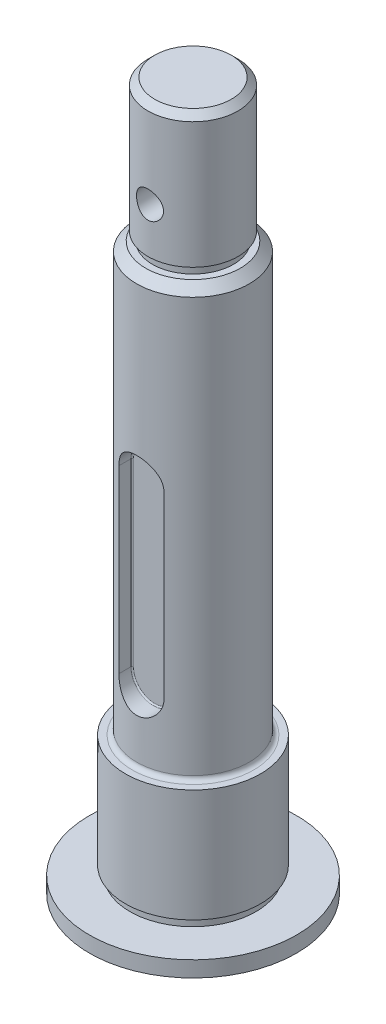
ISO-10303-21;
HEADER;
FILE_DESCRIPTION(('STEP AP214'),'2;1');
FILE_NAME('part.step','',(''),(''),'','','');
FILE_SCHEMA(('AUTOMOTIVE_DESIGN { 1 0 10303 214 1 1 1 1 }'));
ENDSEC;
DATA;
#1=APPLICATION_CONTEXT('core data for automotive mechanical design processes');
#2=APPLICATION_PROTOCOL_DEFINITION('international standard','automotive_design',2000,#1);
#3=PRODUCT_CONTEXT('',#1,'mechanical');
#4=PRODUCT('Part','Part','',(#3));
#5=PRODUCT_RELATED_PRODUCT_CATEGORY('part','',(#4));
#6=PRODUCT_DEFINITION_FORMATION('','',#4);
#7=PRODUCT_DEFINITION_CONTEXT('part definition',#1,'design');
#8=PRODUCT_DEFINITION('design','',#6,#7);
#9=PRODUCT_DEFINITION_SHAPE('','',#8);
#10=(LENGTH_UNIT() NAMED_UNIT(*) SI_UNIT(.MILLI.,.METRE.));
#11=(NAMED_UNIT(*) PLANE_ANGLE_UNIT() SI_UNIT($,.RADIAN.));
#12=(NAMED_UNIT(*) SI_UNIT($,.STERADIAN.) SOLID_ANGLE_UNIT());
#13=UNCERTAINTY_MEASURE_WITH_UNIT(LENGTH_MEASURE(1.E-05),#10,'distance_accuracy_value','');
#14=(GEOMETRIC_REPRESENTATION_CONTEXT(3) GLOBAL_UNCERTAINTY_ASSIGNED_CONTEXT((#13)) GLOBAL_UNIT_ASSIGNED_CONTEXT((#10,
#11,#12)) REPRESENTATION_CONTEXT('',''));
#15=CARTESIAN_POINT('',(0.,0.,0.));
#16=DIRECTION('',(0.,0.,1.));
#17=DIRECTION('',(1.,0.,0.));
#18=AXIS2_PLACEMENT_3D('',#15,#16,#17);
#19=CARTESIAN_POINT('',(0.,0.,0.));
#20=DIRECTION('',(0.,1.,0.));
#21=DIRECTION('',(-1.,0.,0.));
#22=AXIS2_PLACEMENT_3D('',#19,#20,#21);
#23=PLANE('',#22);
#24=CARTESIAN_POINT('',(0.,0.,0.));
#25=DIRECTION('',(0.,1.,0.));
#26=DIRECTION('',(-1.,0.,0.));
#27=AXIS2_PLACEMENT_3D('',#24,#25,#26);
#28=CIRCLE('',#27,23.);
#29=CARTESIAN_POINT('',(-23.,0.,0.));
#30=VERTEX_POINT('',#29);
#31=EDGE_CURVE('E115',#30,#30,#28,.T.);
#32=ORIENTED_EDGE('',*,*,#31,.F.);
#33=EDGE_LOOP('',(#32));
#34=FACE_BOUND('',#33,.T.);
#35=ADVANCED_FACE('F35',(#34),#23,.F.);
#36=CARTESIAN_POINT('',(0.,157.,0.));
#37=DIRECTION('',(0.,1.,0.));
#38=DIRECTION('',(-1.,0.,0.));
#39=AXIS2_PLACEMENT_3D('',#36,#37,#38);
#40=CYLINDRICAL_SURFACE('',#39,23.);
#41=CARTESIAN_POINT('',(0.,3.5,0.));
#42=DIRECTION('',(0.,1.,0.));
#43=DIRECTION('',(-1.,0.,0.));
#44=AXIS2_PLACEMENT_3D('',#41,#42,#43);
#45=CIRCLE('',#44,23.);
#46=CARTESIAN_POINT('',(-23.,3.5,0.));
#47=VERTEX_POINT('',#46);
#48=EDGE_CURVE('E119',#47,#47,#45,.T.);
#49=ORIENTED_EDGE('',*,*,#48,.F.);
#50=EDGE_LOOP('',(#49));
#51=FACE_BOUND('',#50,.T.);
#52=ORIENTED_EDGE('',*,*,#31,.T.);
#53=EDGE_LOOP('',(#52));
#54=FACE_BOUND('',#53,.T.);
#55=ADVANCED_FACE('F181',(#51,#54),#40,.T.);
#56=CARTESIAN_POINT('',(23.,3.5,0.));
#57=DIRECTION('',(0.,-1.,0.));
#58=DIRECTION('',(1.,0.,0.));
#59=AXIS2_PLACEMENT_3D('',#56,#57,#58);
#60=PLANE('',#59);
#61=CARTESIAN_POINT('',(0.,3.5,0.));
#62=DIRECTION('',(0.,1.,0.));
#63=DIRECTION('',(-1.,0.,0.));
#64=AXIS2_PLACEMENT_3D('',#61,#62,#63);
#65=CIRCLE('',#64,14.);
#66=CARTESIAN_POINT('',(-14.,3.5,0.));
#67=VERTEX_POINT('',#66);
#68=EDGE_CURVE('E277',#67,#67,#65,.T.);
#69=ORIENTED_EDGE('',*,*,#68,.F.);
#70=EDGE_LOOP('',(#69));
#71=FACE_BOUND('',#70,.T.);
#72=ORIENTED_EDGE('',*,*,#48,.T.);
#73=EDGE_LOOP('',(#72));
#74=FACE_BOUND('',#73,.T.);
#75=ADVANCED_FACE('F187',(#71,#74),#60,.F.);
#76=CARTESIAN_POINT('',(0.,157.,0.));
#77=DIRECTION('',(0.,1.,0.));
#78=DIRECTION('',(-1.,0.,0.));
#79=AXIS2_PLACEMENT_3D('',#76,#77,#78);
#80=CYLINDRICAL_SURFACE('',#79,14.);
#81=CARTESIAN_POINT('',(0.,5.50000000000001,0.));
#82=DIRECTION('',(0.,1.,0.));
#83=DIRECTION('',(-1.,0.,0.));
#84=AXIS2_PLACEMENT_3D('',#81,#82,#83);
#85=CIRCLE('',#84,14.);
#86=CARTESIAN_POINT('',(-14.,5.50000000000001,0.));
#87=VERTEX_POINT('',#86);
#88=EDGE_CURVE('E274',#87,#87,#85,.T.);
#89=ORIENTED_EDGE('',*,*,#88,.F.);
#90=EDGE_LOOP('',(#89));
#91=FACE_BOUND('',#90,.T.);
#92=ORIENTED_EDGE('',*,*,#68,.T.);
#93=EDGE_LOOP('',(#92));
#94=FACE_BOUND('',#93,.T.);
#95=ADVANCED_FACE('F284',(#91,#94),#80,.T.);
#96=CARTESIAN_POINT('',(14.,5.5,0.));
#97=DIRECTION('',(0.,1.,0.));
#98=DIRECTION('',(-1.,0.,0.));
#99=AXIS2_PLACEMENT_3D('',#96,#97,#98);
#100=PLANE('',#99);
#101=CARTESIAN_POINT('',(0.,5.50000000000001,0.));
#102=DIRECTION('',(0.,1.,0.));
#103=DIRECTION('',(-1.,0.,0.));
#104=AXIS2_PLACEMENT_3D('',#101,#102,#103);
#105=CIRCLE('',#104,15.);
#106=CARTESIAN_POINT('',(-15.,5.50000000000001,0.));
#107=VERTEX_POINT('',#106);
#108=EDGE_CURVE('E271',#107,#107,#105,.T.);
#109=ORIENTED_EDGE('',*,*,#108,.F.);
#110=EDGE_LOOP('',(#109));
#111=FACE_BOUND('',#110,.T.);
#112=ORIENTED_EDGE('',*,*,#88,.T.);
#113=EDGE_LOOP('',(#112));
#114=FACE_BOUND('',#113,.T.);
#115=ADVANCED_FACE('F289',(#111,#114),#100,.F.);
#116=CARTESIAN_POINT('',(0.,157.,0.));
#117=DIRECTION('',(0.,1.,0.));
#118=DIRECTION('',(-1.,0.,0.));
#119=AXIS2_PLACEMENT_3D('',#116,#117,#118);
#120=CYLINDRICAL_SURFACE('',#119,15.);
#121=CARTESIAN_POINT('',(0.,30.5,0.));
#122=DIRECTION('',(0.,1.,0.));
#123=DIRECTION('',(-1.,0.,0.));
#124=AXIS2_PLACEMENT_3D('',#121,#122,#123);
#125=CIRCLE('',#124,15.);
#126=CARTESIAN_POINT('',(-15.,30.5,0.));
#127=VERTEX_POINT('',#126);
#128=EDGE_CURVE('E268',#127,#127,#125,.T.);
#129=ORIENTED_EDGE('',*,*,#128,.F.);
#130=EDGE_LOOP('',(#129));
#131=FACE_BOUND('',#130,.T.);
#132=ORIENTED_EDGE('',*,*,#108,.T.);
#133=EDGE_LOOP('',(#132));
#134=FACE_BOUND('',#133,.T.);
#135=ADVANCED_FACE('F296',(#131,#134),#120,.T.);
#136=CARTESIAN_POINT('',(15.,30.5,0.));
#137=DIRECTION('',(0.,-1.,0.));
#138=DIRECTION('',(1.,0.,0.));
#139=AXIS2_PLACEMENT_3D('',#136,#137,#138);
#140=PLANE('',#139);
#141=CARTESIAN_POINT('',(0.,30.5,0.));
#142=DIRECTION('',(0.,1.,0.));
#143=DIRECTION('',(-1.,0.,0.));
#144=AXIS2_PLACEMENT_3D('',#141,#142,#143);
#145=CIRCLE('',#144,13.5);
#146=CARTESIAN_POINT('',(-13.5,30.5,0.));
#147=VERTEX_POINT('',#146);
#148=EDGE_CURVE('E265',#147,#147,#145,.T.);
#149=ORIENTED_EDGE('',*,*,#148,.F.);
#150=EDGE_LOOP('',(#149));
#151=FACE_BOUND('',#150,.T.);
#152=ORIENTED_EDGE('',*,*,#128,.T.);
#153=EDGE_LOOP('',(#152));
#154=FACE_BOUND('',#153,.T.);
#155=ADVANCED_FACE('F300',(#151,#154),#140,.F.);
#156=CARTESIAN_POINT('',(0.,31.5,0.));
#157=DIRECTION('',(0.,1.,0.));
#158=DIRECTION('',(-1.,0.,0.));
#159=AXIS2_PLACEMENT_3D('',#156,#157,#158);
#160=TOROIDAL_SURFACE('',#159,13.5,0.999999999999999);
#161=CARTESIAN_POINT('',(0.,31.5,0.));
#162=DIRECTION('',(0.,1.,0.));
#163=DIRECTION('',(-1.,0.,0.));
#164=AXIS2_PLACEMENT_3D('',#161,#162,#163);
#165=CIRCLE('',#164,12.5);
#166=CARTESIAN_POINT('',(-12.5,31.5,0.));
#167=VERTEX_POINT('',#166);
#168=EDGE_CURVE('E262',#167,#167,#165,.T.);
#169=ORIENTED_EDGE('',*,*,#168,.F.);
#170=EDGE_LOOP('',(#169));
#171=FACE_BOUND('',#170,.T.);
#172=ORIENTED_EDGE('',*,*,#148,.T.);
#173=EDGE_LOOP('',(#172));
#174=FACE_BOUND('',#173,.T.);
#175=ADVANCED_FACE('F303',(#171,#174),#160,.F.);
#176=CARTESIAN_POINT('',(0.,157.,0.));
#177=DIRECTION('',(0.,1.,0.));
#178=DIRECTION('',(-1.,0.,0.));
#179=AXIS2_PLACEMENT_3D('',#176,#177,#178);
#180=CYLINDRICAL_SURFACE('',#179,12.5);
#181=DIRECTION('',(0.,1.,0.));
#182=VECTOR('',#181,1.);
#183=CARTESIAN_POINT('',(-5.00000000000001,157.,11.4564392373896));
#184=LINE('',#183,#182);
#185=CARTESIAN_POINT('',(-4.99999999999999,45.5,11.4564392373896));
#186=VERTEX_POINT('',#185);
#187=CARTESIAN_POINT('',(-5.00000000000001,85.4999999999999,11.4564392373896));
#188=VERTEX_POINT('',#187);
#189=EDGE_CURVE('E109',#186,#188,#184,.T.);
#190=ORIENTED_EDGE('',*,*,#189,.T.);
#191=CARTESIAN_POINT('',(-5.00000000000001,85.4999999999999,11.4564392373896));
#192=CARTESIAN_POINT('',(-5.00002116024616,85.6345124320606,11.4564109509945));
#193=CARTESIAN_POINT('',(-4.99457288869913,85.7690130645395,11.4588073206432));
#194=CARTESIAN_POINT('',(-4.97289704500259,86.0369293446743,11.4682409636927));
#195=CARTESIAN_POINT('',(-4.95667357829301,86.1703453859789,11.4752764695362));
#196=CARTESIAN_POINT('',(-4.91369129558914,86.4346148649349,11.4937439172796));
#197=CARTESIAN_POINT('',(-4.88697412617558,86.5654763118979,11.5051584758264));
#198=CARTESIAN_POINT('',(-4.82328654884511,86.8242595779647,11.5320036246689));
#199=CARTESIAN_POINT('',(-4.78631551505478,86.9521812171127,11.5474344601058));
#200=CARTESIAN_POINT('',(-4.70252103978111,87.2040793676233,11.5818106822086));
#201=CARTESIAN_POINT('',(-4.65571075709794,87.3280608959935,11.6007513709062));
#202=CARTESIAN_POINT('',(-4.55261160789531,87.5715287286217,11.6415978912418));
#203=CARTESIAN_POINT('',(-4.4963191779988,87.6910133222088,11.6635048369856));
#204=CARTESIAN_POINT('',(-4.31376922877803,88.0418102403852,11.7327894866887));
#205=CARTESIAN_POINT('',(-4.17383337305161,88.2654826382452,11.7837334464308));
#206=CARTESIAN_POINT('',(-3.85328699437734,88.6982019808576,11.8925290853841));
#207=CARTESIAN_POINT('',(-3.67095756312249,88.9059091956254,11.9506010980043));
#208=CARTESIAN_POINT('',(-3.27420643347806,89.2888595291701,12.0653248053599));
#209=CARTESIAN_POINT('',(-3.05977816286379,89.4640959830899,12.1219762064459));
#210=CARTESIAN_POINT('',(-2.71343385084917,89.7021452098314,12.2025476404464));
#211=CARTESIAN_POINT('',(-2.59127203287559,89.7785668493419,12.229134001304));
#212=CARTESIAN_POINT('',(-2.34039970046137,89.9207787547715,12.2796116610867));
#213=CARTESIAN_POINT('',(-2.21169191329334,89.9865734013116,12.3035040692708));
#214=CARTESIAN_POINT('',(-1.94856415474309,90.1069555865197,12.3479110926869));
#215=CARTESIAN_POINT('',(-1.81414357108403,90.1615419202468,12.3684253447059));
#216=CARTESIAN_POINT('',(-1.5406320394055,90.2589400533107,12.4054617264858));
#217=CARTESIAN_POINT('',(-1.40154340020451,90.301757579931,12.4219857975888));
#218=CARTESIAN_POINT('',(-1.12649875188942,90.3734195005113,12.4498667432373));
#219=CARTESIAN_POINT('',(-0.990712972335601,90.4028360840672,12.4614336192513));
#220=CARTESIAN_POINT('',(-0.716923447431974,90.4502841254754,12.480177753411));
#221=CARTESIAN_POINT('',(-0.578920699676974,90.4683205647395,12.4873569321329));
#222=CARTESIAN_POINT('',(-0.3017429280837,90.4928255327452,12.4971268844119));
#223=CARTESIAN_POINT('',(-0.162568016896016,90.4992951606507,12.4997180939517));
#224=CARTESIAN_POINT('',(0.115842484012882,90.5005956749877,12.500238240505));
#225=CARTESIAN_POINT('',(0.25507807142947,90.4954269704835,12.4981673413824));
#226=CARTESIAN_POINT('',(0.524651970400589,90.4741308146542,12.4896713366005));
#227=CARTESIAN_POINT('',(0.655048966944768,90.4586382483151,12.4834985427991));
#228=CARTESIAN_POINT('',(0.914022837957907,90.4174952903848,12.4672131439381));
#229=CARTESIAN_POINT('',(1.0425990928298,90.3918415230812,12.4570992295938));
#230=CARTESIAN_POINT('',(1.29697755626972,90.3306263277609,12.4331876533791));
#231=CARTESIAN_POINT('',(1.42278070740589,90.2950683239934,12.4193912647406));
#232=CARTESIAN_POINT('',(1.67086757221275,90.2143659568798,12.3884570972524));
#233=CARTESIAN_POINT('',(1.79314992921957,90.1692179529119,12.3713180496423));
#234=CARTESIAN_POINT('',(2.15709687028237,90.0184541657438,12.3149325863107));
#235=CARTESIAN_POINT('',(2.39225143382088,89.8983913777321,12.2710729537441));
#236=CARTESIAN_POINT('',(2.83955938188382,89.6238240436676,12.175361464094));
#237=CARTESIAN_POINT('',(3.05170465810883,89.4693074145782,12.1235068051106));
#238=CARTESIAN_POINT('',(3.46189166322706,89.1184034138569,12.0130472510456));
#239=CARTESIAN_POINT('',(3.65809600081913,88.9199346428211,11.9542226888218));
#240=CARTESIAN_POINT('',(4.01527141902245,88.4925089145393,11.8390417472991));
#241=CARTESIAN_POINT('',(4.17622644798531,88.2635381434619,11.7826865017702));
#242=CARTESIAN_POINT('',(4.38982639253539,87.8979555339677,11.7040767056709));
#243=CARTESIAN_POINT('',(4.45714070918035,87.7704102321506,11.67853963431));
#244=CARTESIAN_POINT('',(4.58068459393733,87.5095096052855,11.6306369662179));
#245=CARTESIAN_POINT('',(4.63691894003212,87.3761568150088,11.6082700036232));
#246=CARTESIAN_POINT('',(4.73770315812052,87.1047138431704,11.5675031334143));
#247=CARTESIAN_POINT('',(4.7822675419941,86.9666297891435,11.5490983039107));
#248=CARTESIAN_POINT('',(4.85931060760166,86.6866645381195,11.5168933461878));
#249=CARTESIAN_POINT('',(4.89179470795395,86.5447850742428,11.5030911537407));
#250=CARTESIAN_POINT('',(4.94524241843461,86.253193191337,11.4802224777034));
#251=CARTESIAN_POINT('',(4.96575156895815,86.1033822570495,11.4713433844497));
#252=CARTESIAN_POINT('',(4.99314310596509,85.8023863383243,11.4594310700134));
#253=CARTESIAN_POINT('',(5.0000338891365,85.6512022583381,11.4563942466884));
#254=CARTESIAN_POINT('',(5.,85.4999999999999,11.4564392373896));
#255=B_SPLINE_CURVE_WITH_KNOTS('',3,(#191,#192,#193,#194,#195,#196,#197,#198,#199,#200,#201,
#202,#203,#204,#205,#206,#207,#208,#209,#210,#211,#212,#213,#214,#215,#216,#217,#218,#219,#220,
#221,#222,#223,#224,#225,#226,#227,#228,#229,#230,#231,#232,#233,#234,#235,#236,#237,#238,#239,
#240,#241,#242,#243,#244,#245,#246,#247,#248,#249,#250,#251,#252,#253,#254),.UNSPECIFIED.,.F.,
.F.,(4,2,2,2,2,2,2,2,2,2,2,2,2,2,2,2,2,2,2,2,2,2,2,2,2,2,2,2,2,2,2,4),(0.,0.403387132772953,
0.806620659758034,1.20826977817943,1.60994341778078,2.01108324721979,2.4123741621189,
3.21490253133681,4.05861785764907,4.90250617122559,5.34163056425766,5.780573478467,
6.21956355621626,6.65833961990581,7.07604861266469,7.49357463528174,7.91106097937957,
8.32853264988812,8.72244552722558,9.11648937858482,9.51039716361132,9.90445475472554,
10.7036301452728,11.5030862504097,12.3549725889497,13.2072460521693,13.6461605184396,
14.0848852966823,14.5230618911476,14.9610417034976,15.4147136276398,15.8681057435335),.UNSPECIFIED.);
#256=CARTESIAN_POINT('',(5.,85.4999999999999,11.4564392373896));
#257=VERTEX_POINT('',#256);
#258=EDGE_CURVE('E95',#188,#257,#255,.T.);
#259=ORIENTED_EDGE('',*,*,#258,.T.);
#260=DIRECTION('',(0.,1.,0.));
#261=VECTOR('',#260,1.);
#262=CARTESIAN_POINT('',(5.00000000000001,157.,11.4564392373896));
#263=LINE('',#262,#261);
#264=CARTESIAN_POINT('',(5.00000000000001,45.5,11.4564392373896));
#265=VERTEX_POINT('',#264);
#266=EDGE_CURVE('E103',#257,#265,#263,.F.);
#267=ORIENTED_EDGE('',*,*,#266,.T.);
#268=CARTESIAN_POINT('',(4.99999999999999,45.5,11.4564392373896));
#269=CARTESIAN_POINT('',(5.00002116024614,45.3654875679393,11.4564109509945));
#270=CARTESIAN_POINT('',(4.99457288869911,45.2309869354604,11.4588073206432));
#271=CARTESIAN_POINT('',(4.97289704500257,44.9630706553256,11.4682409636927));
#272=CARTESIAN_POINT('',(4.95667357829299,44.8296546140211,11.4752764695362));
#273=CARTESIAN_POINT('',(4.91369129558912,44.565385135065,11.4937439172796));
#274=CARTESIAN_POINT('',(4.88697412617556,44.434523688102,11.5051584758264));
#275=CARTESIAN_POINT('',(4.8232865488451,44.1757404220352,11.5320036246689));
#276=CARTESIAN_POINT('',(4.78631551505476,44.0478187828872,11.5474344601058));
#277=CARTESIAN_POINT('',(4.70252103978109,43.7959206323767,11.5818106822086));
#278=CARTESIAN_POINT('',(4.65571075709792,43.6719391040064,11.6007513709062));
#279=CARTESIAN_POINT('',(4.5526116078953,43.4284712713783,11.6415978912418));
#280=CARTESIAN_POINT('',(4.49631917799878,43.3089866777911,11.6635048369856));
#281=CARTESIAN_POINT('',(4.31376922877801,42.9581897596147,11.7327894866887));
#282=CARTESIAN_POINT('',(4.1738333730516,42.7345173617548,11.7837334464308));
#283=CARTESIAN_POINT('',(3.85328699437733,42.3017980191423,11.8925290853841));
#284=CARTESIAN_POINT('',(3.67095756312248,42.0940908043745,11.9506010980043));
#285=CARTESIAN_POINT('',(3.27420643347805,41.7111404708298,12.0653248053599));
#286=CARTESIAN_POINT('',(3.05977816286378,41.53590401691,12.1219762064459));
#287=CARTESIAN_POINT('',(2.71343385084916,41.2978547901685,12.2025476404464));
#288=CARTESIAN_POINT('',(2.59127203287557,41.2214331506581,12.229134001304));
#289=CARTESIAN_POINT('',(2.34039970046135,41.0792212452285,12.2796116610867));
#290=CARTESIAN_POINT('',(2.21169191329332,41.0134265986884,12.3035040692708));
#291=CARTESIAN_POINT('',(1.94856415474307,40.8930444134802,12.3479110926869));
#292=CARTESIAN_POINT('',(1.81414357108401,40.8384580797531,12.3684253447059));
#293=CARTESIAN_POINT('',(1.54063203940548,40.7410599466892,12.4054617264858));
#294=CARTESIAN_POINT('',(1.40154340020449,40.6982424200689,12.4219857975888));
#295=CARTESIAN_POINT('',(1.1264987518894,40.6265804994886,12.4498667432373));
#296=CARTESIAN_POINT('',(0.990712972335582,40.5971639159328,12.4614336192513));
#297=CARTESIAN_POINT('',(0.716923447431953,40.5497158745245,12.480177753411));
#298=CARTESIAN_POINT('',(0.578920699676954,40.5316794352604,12.4873569321329));
#299=CARTESIAN_POINT('',(0.301742928083682,40.5071744672548,12.4971268844119));
#300=CARTESIAN_POINT('',(0.162568016895998,40.5007048393492,12.4997180939517));
#301=CARTESIAN_POINT('',(-0.115842484012899,40.4994043250122,12.500238240505));
#302=CARTESIAN_POINT('',(-0.255078071429487,40.5045730295164,12.4981673413824));
#303=CARTESIAN_POINT('',(-0.524651970400604,40.5258691853457,12.4896713366005));
#304=CARTESIAN_POINT('',(-0.655048966944781,40.5413617516848,12.4834985427991));
#305=CARTESIAN_POINT('',(-0.914022837957918,40.5825047096151,12.4672131439381));
#306=CARTESIAN_POINT('',(-1.04259909282981,40.6081584769187,12.4570992295938));
#307=CARTESIAN_POINT('',(-1.29697755626973,40.6693736722391,12.4331876533791));
#308=CARTESIAN_POINT('',(-1.4227807074059,40.7049316760065,12.4193912647406));
#309=CARTESIAN_POINT('',(-1.67086757221276,40.7856340431202,12.3884570972524));
#310=CARTESIAN_POINT('',(-1.79314992921958,40.830782047088,12.3713180496423));
#311=CARTESIAN_POINT('',(-2.15709687028238,40.9815458342561,12.3149325863107));
#312=CARTESIAN_POINT('',(-2.39225143382089,41.1016086222678,12.2710729537441));
#313=CARTESIAN_POINT('',(-2.83955938188382,41.3761759563323,12.175361464094));
#314=CARTESIAN_POINT('',(-3.05170465810884,41.5306925854218,12.1235068051106));
#315=CARTESIAN_POINT('',(-3.46189166322707,41.881596586143,12.0130472510456));
#316=CARTESIAN_POINT('',(-3.65809600081914,42.0800653571789,11.9542226888218));
#317=CARTESIAN_POINT('',(-4.01527141902246,42.5074910854606,11.8390417472991));
#318=CARTESIAN_POINT('',(-4.17622644798532,42.736461856538,11.7826865017702));
#319=CARTESIAN_POINT('',(-4.3898263925354,43.1020444660322,11.7040767056709));
#320=CARTESIAN_POINT('',(-4.45714070918036,43.2295897678493,11.67853963431));
#321=CARTESIAN_POINT('',(-4.58068459393734,43.4904903947145,11.6306369662179));
#322=CARTESIAN_POINT('',(-4.63691894003213,43.6238431849912,11.6082700036232));
#323=CARTESIAN_POINT('',(-4.73770315812053,43.8952861568295,11.5675031334143));
#324=CARTESIAN_POINT('',(-4.78226754199411,44.0333702108564,11.5490983039107));
#325=CARTESIAN_POINT('',(-4.85931060760167,44.3133354618804,11.5168933461878));
#326=CARTESIAN_POINT('',(-4.89179470795396,44.4552149257571,11.5030911537407));
#327=CARTESIAN_POINT('',(-4.94524241843462,44.7468068086629,11.4802224777034));
#328=CARTESIAN_POINT('',(-4.96575156895816,44.8966177429504,11.4713433844497));
#329=CARTESIAN_POINT('',(-4.9931431059651,45.1976136616756,11.4594310700134));
#330=CARTESIAN_POINT('',(-5.00003388913651,45.3487977416618,11.4563942466884));
#331=CARTESIAN_POINT('',(-5.,45.5,11.4564392373896));
#332=B_SPLINE_CURVE_WITH_KNOTS('',3,(#268,#269,#270,#271,#272,#273,#274,#275,#276,#277,#278,
#279,#280,#281,#282,#283,#284,#285,#286,#287,#288,#289,#290,#291,#292,#293,#294,#295,#296,#297,
#298,#299,#300,#301,#302,#303,#304,#305,#306,#307,#308,#309,#310,#311,#312,#313,#314,#315,#316,
#317,#318,#319,#320,#321,#322,#323,#324,#325,#326,#327,#328,#329,#330,#331),.UNSPECIFIED.,.F.,
.F.,(4,2,2,2,2,2,2,2,2,2,2,2,2,2,2,2,2,2,2,2,2,2,2,2,2,2,2,2,2,2,2,4),(0.,0.403387132772953,
0.806620659758027,1.20826977817944,1.60994341778077,2.01108324721977,2.41237416211889,
3.2149025313368,4.05861785764906,4.90250617122559,5.34163056425765,5.78057347846699,
6.21956355621626,6.6583396199058,7.07604861266469,7.49357463528174,7.91106097937956,
8.32853264988811,8.72244552722557,9.11648937858481,9.5103971636113,9.90445475472552,
10.7036301452728,11.5030862504096,12.3549725889497,13.2072460521693,13.6461605184395,
14.0848852966823,14.5230618911475,14.9610417034976,15.4147136276398,15.8681057435335),.UNSPECIFIED.);
#333=EDGE_CURVE('E110',#265,#186,#332,.T.);
#334=ORIENTED_EDGE('',*,*,#333,.T.);
#335=EDGE_LOOP('',(#190,#259,#267,#334));
#336=FACE_BOUND('',#335,.T.);
#337=CARTESIAN_POINT('',(0.,123.5,0.));
#338=DIRECTION('',(0.,1.,0.));
#339=DIRECTION('',(-1.,0.,0.));
#340=AXIS2_PLACEMENT_3D('',#337,#338,#339);
#341=CIRCLE('',#340,12.5);
#342=CARTESIAN_POINT('',(-12.5,123.5,0.));
#343=VERTEX_POINT('',#342);
#344=EDGE_CURVE('E259',#343,#343,#341,.T.);
#345=ORIENTED_EDGE('',*,*,#344,.F.);
#346=EDGE_LOOP('',(#345));
#347=FACE_BOUND('',#346,.T.);
#348=ORIENTED_EDGE('',*,*,#168,.T.);
#349=EDGE_LOOP('',(#348));
#350=FACE_BOUND('',#349,.T.);
#351=ADVANCED_FACE('F112',(#336,#347,#350),#180,.T.);
#352=CARTESIAN_POINT('',(0.,123.5,0.));
#353=DIRECTION('',(0.,-1.,0.));
#354=DIRECTION('',(1.,0.,0.));
#355=AXIS2_PLACEMENT_3D('',#352,#353,#354);
#356=CONICAL_SURFACE('',#355,12.5,0.785398163397453);
#357=CARTESIAN_POINT('',(0.,125.5,0.));
#358=DIRECTION('',(0.,1.,0.));
#359=DIRECTION('',(-1.,0.,0.));
#360=AXIS2_PLACEMENT_3D('',#357,#358,#359);
#361=CIRCLE('',#360,10.5);
#362=CARTESIAN_POINT('',(-10.5,125.5,0.));
#363=VERTEX_POINT('',#362);
#364=EDGE_CURVE('E256',#363,#363,#361,.T.);
#365=ORIENTED_EDGE('',*,*,#364,.F.);
#366=EDGE_LOOP('',(#365));
#367=FACE_BOUND('',#366,.T.);
#368=ORIENTED_EDGE('',*,*,#344,.T.);
#369=EDGE_LOOP('',(#368));
#370=FACE_BOUND('',#369,.T.);
#371=ADVANCED_FACE('F310',(#367,#370),#356,.T.);
#372=CARTESIAN_POINT('',(10.5,125.5,0.));
#373=DIRECTION('',(0.,-1.,0.));
#374=DIRECTION('',(1.,0.,0.));
#375=AXIS2_PLACEMENT_3D('',#372,#373,#374);
#376=PLANE('',#375);
#377=CARTESIAN_POINT('',(0.,125.5,0.));
#378=DIRECTION('',(0.,1.,0.));
#379=DIRECTION('',(-1.,0.,0.));
#380=AXIS2_PLACEMENT_3D('',#377,#378,#379);
#381=CIRCLE('',#380,9.);
#382=CARTESIAN_POINT('',(-9.,125.5,0.));
#383=VERTEX_POINT('',#382);
#384=EDGE_CURVE('E253',#383,#383,#381,.T.);
#385=ORIENTED_EDGE('',*,*,#384,.F.);
#386=EDGE_LOOP('',(#385));
#387=FACE_BOUND('',#386,.T.);
#388=ORIENTED_EDGE('',*,*,#364,.T.);
#389=EDGE_LOOP('',(#388));
#390=FACE_BOUND('',#389,.T.);
#391=ADVANCED_FACE('F325',(#387,#390),#376,.F.);
#392=CARTESIAN_POINT('',(0.,157.,0.));
#393=DIRECTION('',(0.,1.,0.));
#394=DIRECTION('',(-1.,0.,0.));
#395=AXIS2_PLACEMENT_3D('',#392,#393,#394);
#396=CYLINDRICAL_SURFACE('',#395,9.);
#397=CARTESIAN_POINT('',(0.,127.5,0.));
#398=DIRECTION('',(0.,1.,0.));
#399=DIRECTION('',(-1.,0.,0.));
#400=AXIS2_PLACEMENT_3D('',#397,#398,#399);
#401=CIRCLE('',#400,9.);
#402=CARTESIAN_POINT('',(-9.,127.5,0.));
#403=VERTEX_POINT('',#402);
#404=EDGE_CURVE('E250',#403,#403,#401,.T.);
#405=ORIENTED_EDGE('',*,*,#404,.F.);
#406=EDGE_LOOP('',(#405));
#407=FACE_BOUND('',#406,.T.);
#408=ORIENTED_EDGE('',*,*,#384,.T.);
#409=EDGE_LOOP('',(#408));
#410=FACE_BOUND('',#409,.T.);
#411=ADVANCED_FACE('F330',(#407,#410),#396,.T.);
#412=CARTESIAN_POINT('',(10.,127.5,0.));
#413=DIRECTION('',(0.,1.,0.));
#414=DIRECTION('',(-1.,0.,0.));
#415=AXIS2_PLACEMENT_3D('',#412,#413,#414);
#416=PLANE('',#415);
#417=CARTESIAN_POINT('',(0.,127.5,0.));
#418=DIRECTION('',(0.,1.,0.));
#419=DIRECTION('',(-1.,0.,0.));
#420=AXIS2_PLACEMENT_3D('',#417,#418,#419);
#421=CIRCLE('',#420,10.);
#422=CARTESIAN_POINT('',(-10.,127.5,0.));
#423=VERTEX_POINT('',#422);
#424=EDGE_CURVE('E247',#423,#423,#421,.T.);
#425=ORIENTED_EDGE('',*,*,#424,.F.);
#426=EDGE_LOOP('',(#425));
#427=FACE_BOUND('',#426,.T.);
#428=ORIENTED_EDGE('',*,*,#404,.T.);
#429=EDGE_LOOP('',(#428));
#430=FACE_BOUND('',#429,.T.);
#431=ADVANCED_FACE('F158',(#427,#430),#416,.F.);
#432=CARTESIAN_POINT('',(0.,157.,0.));
#433=DIRECTION('',(0.,1.,0.));
#434=DIRECTION('',(-1.,0.,0.));
#435=AXIS2_PLACEMENT_3D('',#432,#433,#434);
#436=CYLINDRICAL_SURFACE('',#435,10.);
#437=CARTESIAN_POINT('',(3.,137.5,-9.53939201416946));
#438=CARTESIAN_POINT('',(2.99999795267528,137.664389095885,-9.5393937145396));
#439=CARTESIAN_POINT('',(2.98644216334284,137.828798448288,-9.54368780418138));
#440=CARTESIAN_POINT('',(2.93271688893499,138.152810499184,-9.560331566058));
#441=CARTESIAN_POINT('',(2.89253851147156,138.312411573003,-9.57268392986936));
#442=CARTESIAN_POINT('',(2.78705506539911,138.622069456543,-9.60392204971265));
#443=CARTESIAN_POINT('',(2.72179178788487,138.772141659266,-9.62279693406465));
#444=CARTESIAN_POINT('',(2.56812843835859,139.059243867991,-9.66493865095134));
#445=CARTESIAN_POINT('',(2.47972490274106,139.196271917369,-9.68820614082039));
#446=CARTESIAN_POINT('',(2.27929508283255,139.457732781155,-9.73733724371531));
#447=CARTESIAN_POINT('',(2.16666414351614,139.581691795893,-9.76325616623271));
#448=CARTESIAN_POINT('',(1.9222724751592,139.809275902645,-9.81429723873514));
#449=CARTESIAN_POINT('',(1.79050929092223,139.9128983809,-9.8394192859541));
#450=CARTESIAN_POINT('',(1.5082228755874,140.098925399667,-9.88666429158778));
#451=CARTESIAN_POINT('',(1.35736804267164,140.180846848886,-9.90871448684808));
#452=CARTESIAN_POINT('',(1.04324929073872,140.317974518086,-9.94668871841369));
#453=CARTESIAN_POINT('',(0.879988056775833,140.373186499715,-9.96261407578992));
#454=CARTESIAN_POINT('',(0.550647705261668,140.453760002181,-9.98615292007178));
#455=CARTESIAN_POINT('',(0.384782797907613,140.479930255305,-9.99399114738674));
#456=CARTESIAN_POINT('',(0.0508436474986395,140.504234649293,-10.001264030027));
#457=CARTESIAN_POINT('',(-0.117230124100731,140.502374678804,-10.0007004504217));
#458=CARTESIAN_POINT('',(-0.445142313200298,140.471214262914,-9.99139207635305));
#459=CARTESIAN_POINT('',(-0.605072535282641,140.44278961238,-9.98290840410476));
#460=CARTESIAN_POINT('',(-0.917778426885058,140.360737328011,-9.95903044225232));
#461=CARTESIAN_POINT('',(-1.07055364264576,140.307108098115,-9.94363571501341));
#462=CARTESIAN_POINT('',(-1.36669465270247,140.175575953163,-9.90730441973757));
#463=CARTESIAN_POINT('',(-1.50993012938863,140.097397594386,-9.88630539352773));
#464=CARTESIAN_POINT('',(-1.78152934756662,139.919204295143,-9.84099281296778));
#465=CARTESIAN_POINT('',(-1.90988954974544,139.819184174071,-9.81667847277944));
#466=CARTESIAN_POINT('',(-2.15332096305836,139.595604498499,-9.76623100973852));
#467=CARTESIAN_POINT('',(-2.26768916079755,139.471286161949,-9.74006390633503));
#468=CARTESIAN_POINT('',(-2.47415303080114,139.204979964211,-9.68967959784414));
#469=CARTESIAN_POINT('',(-2.56624648967452,139.062990349189,-9.66546258669242));
#470=CARTESIAN_POINT('',(-2.72627990669512,138.763521061528,-9.62155806359713));
#471=CARTESIAN_POINT('',(-2.79397978469378,138.605905908383,-9.60191621258491));
#472=CARTESIAN_POINT('',(-2.9016672575074,138.280785583221,-9.5699278496379));
#473=CARTESIAN_POINT('',(-2.94166389279494,138.113283656965,-9.5575789579664));
#474=CARTESIAN_POINT('',(-2.99149540565762,137.779835278498,-9.54209699116239));
#475=CARTESIAN_POINT('',(-3.00239892760807,137.614063552206,-9.53863757349918));
#476=CARTESIAN_POINT('',(-2.99671894465742,137.283054199987,-9.54042384874813));
#477=CARTESIAN_POINT('',(-2.98013928742559,137.11781650254,-9.54566832310787));
#478=CARTESIAN_POINT('',(-2.92091527148479,136.797023244057,-9.56395117112154));
#479=CARTESIAN_POINT('',(-2.87895922862587,136.641327671473,-9.57678353015602));
#480=CARTESIAN_POINT('',(-2.77097155495853,136.339196618371,-9.6085828246183));
#481=CARTESIAN_POINT('',(-2.70493620685512,136.192762571719,-9.62755070717977));
#482=CARTESIAN_POINT('',(-2.54863742393009,135.908965071856,-9.67011670046268));
#483=CARTESIAN_POINT('',(-2.45777128345462,135.771950558028,-9.69382542139644));
#484=CARTESIAN_POINT('',(-2.25510603200769,135.514723787638,-9.74296411293927));
#485=CARTESIAN_POINT('',(-2.14330191069794,135.394515564774,-9.76839449459994));
#486=CARTESIAN_POINT('',(-1.89691026498722,135.169639188371,-9.81927267096329));
#487=CARTESIAN_POINT('',(-1.76162213171489,135.065728742026,-9.84468490126011));
#488=CARTESIAN_POINT('',(-1.47492356918051,134.882066597944,-9.89169703497298));
#489=CARTESIAN_POINT('',(-1.32351394108789,134.802313700437,-9.91329712769434));
#490=CARTESIAN_POINT('',(-1.00987100941044,134.669999938863,-9.95011940949916));
#491=CARTESIAN_POINT('',(-0.847729244075677,134.617235967682,-9.96538906849932));
#492=CARTESIAN_POINT('',(-0.51633993300918,134.539878162219,-9.98803959193653));
#493=CARTESIAN_POINT('',(-0.347094434709531,134.515276268103,-9.9954227134176));
#494=CARTESIAN_POINT('',(-0.0133043077654946,134.495553911891,-10.001330881628));
#495=CARTESIAN_POINT('',(0.151170358172404,134.499334609184,-10.0001861022264));
#496=CARTESIAN_POINT('',(0.477038962328798,134.533643264998,-9.98994528930073));
#497=CARTESIAN_POINT('',(0.638433074693048,134.564169706961,-9.98084970660925));
#498=CARTESIAN_POINT('',(0.951871626082707,134.650423322799,-9.95582336716653));
#499=CARTESIAN_POINT('',(1.10399785470277,134.705876361298,-9.93996705801732));
#500=CARTESIAN_POINT('',(1.3968664755041,134.840163829014,-9.903058860789));
#501=CARTESIAN_POINT('',(1.53760699210115,134.919002100572,-9.88200611899893));
#502=CARTESIAN_POINT('',(1.80860378484112,135.10074691486,-9.83607931656457));
#503=CARTESIAN_POINT('',(1.93838050015354,135.204342860002,-9.81110453847119));
#504=CARTESIAN_POINT('',(2.17907514269189,135.431420776666,-9.76047074424668));
#505=CARTESIAN_POINT('',(2.28998761920387,135.554908475796,-9.73481153282158));
#506=CARTESIAN_POINT('',(2.49312538789096,135.822681556621,-9.68481361262639));
#507=CARTESIAN_POINT('',(2.58469519515912,135.967477106781,-9.66053705386971));
#508=CARTESIAN_POINT('',(2.7420862705755,136.271110348322,-9.61705095017587));
#509=CARTESIAN_POINT('',(2.80791991114577,136.429941247202,-9.59783897193912));
#510=CARTESIAN_POINT('',(2.90603885065899,136.739480863213,-9.5685563343519));
#511=CARTESIAN_POINT('',(2.94117718022463,136.889217293862,-9.5577230968104));
#512=CARTESIAN_POINT('',(2.98815637670288,137.192630444992,-9.54314085194333));
#513=CARTESIAN_POINT('',(3.00000191412191,137.34630636929,-9.53939042442861));
#514=CARTESIAN_POINT('',(3.,137.5,-9.53939201416946));
#515=B_SPLINE_CURVE_WITH_KNOTS('',3,(#437,#438,#439,#440,#441,#442,#443,#444,#445,#446,#447,
#448,#449,#450,#451,#452,#453,#454,#455,#456,#457,#458,#459,#460,#461,#462,#463,#464,#465,#466,
#467,#468,#469,#470,#471,#472,#473,#474,#475,#476,#477,#478,#479,#480,#481,#482,#483,#484,#485,
#486,#487,#488,#489,#490,#491,#492,#493,#494,#495,#496,#497,#498,#499,#500,#501,#502,#503,#504,
#505,#506,#507,#508,#509,#510,#511,#512,#513,#514),.UNSPECIFIED.,.T.,.F.,(4,2,2,2,2,2,2,2,2,2,2,
2,2,2,2,2,2,2,2,2,2,2,2,2,2,2,2,2,2,2,2,2,2,2,2,2,2,2,4),(0.,0.49260033183107,0.985365283377986,
1.47731282893238,1.96933405074019,2.47546300015966,2.98165695742545,3.49831878547287,
4.01486911175753,4.51664280299115,5.0183110820288,5.50400251981758,5.98972471780751,
6.48110418671352,6.9726003318166,7.48304294046556,7.99353624983727,8.50892476494934,
9.02414501262031,9.52016161585827,10.0161087821998,10.4991718988284,10.9823096209678,
11.4784146362398,11.9746385186305,12.4895901220641,13.0045161465361,13.5155078363386,
14.0263532464857,14.5175260782765,15.0086710610072,15.4945419374965,15.9804926898797,
16.4819925411419,16.9836370526499,17.500232793435,18.016579879331,18.477223077201,
18.9377739007233),.UNSPECIFIED.);
#516=CARTESIAN_POINT('',(3.,137.5,-9.53939201416946));
#517=VERTEX_POINT('',#516);
#518=EDGE_CURVE('E39',#517,#517,#515,.T.);
#519=ORIENTED_EDGE('',*,*,#518,.T.);
#520=EDGE_LOOP('',(#519));
#521=FACE_BOUND('',#520,.T.);
#522=CARTESIAN_POINT('',(3.,137.5,9.53939201416946));
#523=CARTESIAN_POINT('',(2.99999795267528,137.335610904115,9.5393937145396));
#524=CARTESIAN_POINT('',(2.98644216334284,137.171201551712,9.54368780418138));
#525=CARTESIAN_POINT('',(2.93271688893499,136.847189500816,9.560331566058));
#526=CARTESIAN_POINT('',(2.89253851147156,136.687588426997,9.57268392986936));
#527=CARTESIAN_POINT('',(2.78705506539911,136.377930543457,9.60392204971265));
#528=CARTESIAN_POINT('',(2.72179178788487,136.227858340734,9.62279693406465));
#529=CARTESIAN_POINT('',(2.56812843835859,135.940756132009,9.66493865095134));
#530=CARTESIAN_POINT('',(2.47972490274106,135.803728082631,9.68820614082039));
#531=CARTESIAN_POINT('',(2.27929508283255,135.542267218845,9.73733724371531));
#532=CARTESIAN_POINT('',(2.16666414351614,135.418308204107,9.76325616623271));
#533=CARTESIAN_POINT('',(1.9222724751592,135.190724097355,9.81429723873514));
#534=CARTESIAN_POINT('',(1.79050929092223,135.0871016191,9.8394192859541));
#535=CARTESIAN_POINT('',(1.5082228755874,134.901074600333,9.88666429158778));
#536=CARTESIAN_POINT('',(1.35736804267164,134.819153151114,9.90871448684808));
#537=CARTESIAN_POINT('',(1.04324929073872,134.682025481914,9.94668871841369));
#538=CARTESIAN_POINT('',(0.879988056775833,134.626813500285,9.96261407578992));
#539=CARTESIAN_POINT('',(0.550647705261669,134.546239997819,9.98615292007178));
#540=CARTESIAN_POINT('',(0.384782797907614,134.520069744695,9.99399114738674));
#541=CARTESIAN_POINT('',(0.0508436474986407,134.495765350707,10.001264030027));
#542=CARTESIAN_POINT('',(-0.117230124100729,134.497625321196,10.0007004504217));
#543=CARTESIAN_POINT('',(-0.445142313200297,134.528785737086,9.99139207635305));
#544=CARTESIAN_POINT('',(-0.605072535282639,134.55721038762,9.98290840410476));
#545=CARTESIAN_POINT('',(-0.917778426885057,134.639262671989,9.95903044225232));
#546=CARTESIAN_POINT('',(-1.07055364264576,134.692891901886,9.94363571501341));
#547=CARTESIAN_POINT('',(-1.36669465270247,134.824424046837,9.90730441973757));
#548=CARTESIAN_POINT('',(-1.50993012938863,134.902602405614,9.88630539352773));
#549=CARTESIAN_POINT('',(-1.78152934756662,135.080795704857,9.84099281296778));
#550=CARTESIAN_POINT('',(-1.90988954974544,135.180815825929,9.81667847277944));
#551=CARTESIAN_POINT('',(-2.15332096305836,135.404395501501,9.76623100973852));
#552=CARTESIAN_POINT('',(-2.26768916079755,135.528713838051,9.74006390633503));
#553=CARTESIAN_POINT('',(-2.47415303080114,135.795020035789,9.68967959784414));
#554=CARTESIAN_POINT('',(-2.56624648967452,135.937009650811,9.66546258669242));
#555=CARTESIAN_POINT('',(-2.72627990669512,136.236478938472,9.62155806359713));
#556=CARTESIAN_POINT('',(-2.79397978469378,136.394094091618,9.60191621258491));
#557=CARTESIAN_POINT('',(-2.9016672575074,136.719214416779,9.5699278496379));
#558=CARTESIAN_POINT('',(-2.94166389279494,136.886716343035,9.5575789579664));
#559=CARTESIAN_POINT('',(-2.99149540565762,137.220164721502,9.54209699116239));
#560=CARTESIAN_POINT('',(-3.00239892760807,137.385936447794,9.53863757349918));
#561=CARTESIAN_POINT('',(-2.99671894465742,137.716945800013,9.54042384874813));
#562=CARTESIAN_POINT('',(-2.98013928742559,137.88218349746,9.54566832310787));
#563=CARTESIAN_POINT('',(-2.92091527148479,138.202976755943,9.56395117112154));
#564=CARTESIAN_POINT('',(-2.87895922862587,138.358672328527,9.57678353015602));
#565=CARTESIAN_POINT('',(-2.77097155495853,138.660803381629,9.6085828246183));
#566=CARTESIAN_POINT('',(-2.70493620685513,138.807237428281,9.62755070717978));
#567=CARTESIAN_POINT('',(-2.54863742393009,139.091034928144,9.67011670046269));
#568=CARTESIAN_POINT('',(-2.45777128345461,139.228049441972,9.69382542139644));
#569=CARTESIAN_POINT('',(-2.25510603200769,139.485276212362,9.74296411293927));
#570=CARTESIAN_POINT('',(-2.14330191069794,139.605484435226,9.76839449459994));
#571=CARTESIAN_POINT('',(-1.89691026498722,139.830360811629,9.8192726709633));
#572=CARTESIAN_POINT('',(-1.76162213171489,139.934271257974,9.84468490126012));
#573=CARTESIAN_POINT('',(-1.47492356918051,140.117933402056,9.89169703497298));
#574=CARTESIAN_POINT('',(-1.32351394108789,140.197686299563,9.91329712769433));
#575=CARTESIAN_POINT('',(-1.00987100941044,140.330000061137,9.95011940949916));
#576=CARTESIAN_POINT('',(-0.84772924407567,140.382764032318,9.96538906849932));
#577=CARTESIAN_POINT('',(-0.516339933009173,140.460121837781,9.98803959193654));
#578=CARTESIAN_POINT('',(-0.347094434709529,140.484723731897,9.99542271341761));
#579=CARTESIAN_POINT('',(-0.0133043077654962,140.504446088109,10.001330881628));
#580=CARTESIAN_POINT('',(0.151170358172402,140.500665390816,10.0001861022264));
#581=CARTESIAN_POINT('',(0.477038962328796,140.466356735002,9.98994528930073));
#582=CARTESIAN_POINT('',(0.638433074693046,140.435830293039,9.98084970660925));
#583=CARTESIAN_POINT('',(0.951871626082706,140.349576677201,9.95582336716654));
#584=CARTESIAN_POINT('',(1.10399785470277,140.294123638702,9.93996705801732));
#585=CARTESIAN_POINT('',(1.3968664755041,140.159836170986,9.903058860789));
#586=CARTESIAN_POINT('',(1.53760699210115,140.080997899428,9.88200611899893));
#587=CARTESIAN_POINT('',(1.80860378484111,139.89925308514,9.83607931656457));
#588=CARTESIAN_POINT('',(1.93838050015352,139.795657139998,9.81110453847119));
#589=CARTESIAN_POINT('',(2.17907514269188,139.568579223334,9.76047074424668));
#590=CARTESIAN_POINT('',(2.28998761920386,139.445091524204,9.73481153282159));
#591=CARTESIAN_POINT('',(2.49312538789096,139.177318443379,9.68481361262639));
#592=CARTESIAN_POINT('',(2.58469519515912,139.032522893219,9.66053705386971));
#593=CARTESIAN_POINT('',(2.7420862705755,138.728889651678,9.61705095017587));
#594=CARTESIAN_POINT('',(2.80791991114577,138.570058752798,9.59783897193912));
#595=CARTESIAN_POINT('',(2.90603885065899,138.260519136788,9.5685563343519));
#596=CARTESIAN_POINT('',(2.94117718022463,138.110782706138,9.5577230968104));
#597=CARTESIAN_POINT('',(2.98815637670288,137.807369555009,9.54314085194333));
#598=CARTESIAN_POINT('',(3.00000191412191,137.65369363071,9.53939042442861));
#599=CARTESIAN_POINT('',(3.,137.5,9.53939201416946));
#600=B_SPLINE_CURVE_WITH_KNOTS('',3,(#522,#523,#524,#525,#526,#527,#528,#529,#530,#531,#532,
#533,#534,#535,#536,#537,#538,#539,#540,#541,#542,#543,#544,#545,#546,#547,#548,#549,#550,#551,
#552,#553,#554,#555,#556,#557,#558,#559,#560,#561,#562,#563,#564,#565,#566,#567,#568,#569,#570,
#571,#572,#573,#574,#575,#576,#577,#578,#579,#580,#581,#582,#583,#584,#585,#586,#587,#588,#589,
#590,#591,#592,#593,#594,#595,#596,#597,#598,#599),.UNSPECIFIED.,.T.,.F.,(4,2,2,2,2,2,2,2,2,2,2,
2,2,2,2,2,2,2,2,2,2,2,2,2,2,2,2,2,2,2,2,2,2,2,2,2,2,2,4),(0.,0.49260033183107,0.985365283377986,
1.47731282893238,1.96933405074019,2.47546300015966,2.98165695742545,3.49831878547287,
4.01486911175753,4.51664280299115,5.0183110820288,5.50400251981758,5.98972471780751,
6.48110418671352,6.9726003318166,7.48304294046556,7.99353624983727,8.50892476494934,
9.02414501262031,9.52016161585827,10.0161087821998,10.4991718988284,10.9823096209679,
11.4784146362398,11.9746385186305,12.4895901220641,13.0045161465362,13.5155078363386,
14.0263532464857,14.5175260782765,15.0086710610072,15.4945419374965,15.9804926898797,
16.4819925411418,16.9836370526499,17.500232793435,18.016579879331,18.477223077201,
18.9377739007233),.UNSPECIFIED.);
#601=CARTESIAN_POINT('',(3.,137.5,9.53939201416946));
#602=VERTEX_POINT('',#601);
#603=EDGE_CURVE('E11',#602,#602,#600,.T.);
#604=ORIENTED_EDGE('',*,*,#603,.T.);
#605=EDGE_LOOP('',(#604));
#606=FACE_BOUND('',#605,.T.);
#607=CARTESIAN_POINT('',(0.,155.5,0.));
#608=DIRECTION('',(0.,1.,0.));
#609=DIRECTION('',(-1.,0.,0.));
#610=AXIS2_PLACEMENT_3D('',#607,#608,#609);
#611=CIRCLE('',#610,10.);
#612=CARTESIAN_POINT('',(-10.,155.5,0.));
#613=VERTEX_POINT('',#612);
#614=EDGE_CURVE('E244',#613,#613,#611,.T.);
#615=ORIENTED_EDGE('',*,*,#614,.F.);
#616=EDGE_LOOP('',(#615));
#617=FACE_BOUND('',#616,.T.);
#618=ORIENTED_EDGE('',*,*,#424,.T.);
#619=EDGE_LOOP('',(#618));
#620=FACE_BOUND('',#619,.T.);
#621=ADVANCED_FACE('F153',(#521,#606,#617,#620),#436,.T.);
#622=CARTESIAN_POINT('',(0.,155.5,0.));
#623=DIRECTION('',(0.,-1.,0.));
#624=DIRECTION('',(1.,0.,0.));
#625=AXIS2_PLACEMENT_3D('',#622,#623,#624);
#626=CONICAL_SURFACE('',#625,10.,0.785398163397452);
#627=CARTESIAN_POINT('',(0.,157.,0.));
#628=DIRECTION('',(0.,1.,0.));
#629=DIRECTION('',(-1.,0.,0.));
#630=AXIS2_PLACEMENT_3D('',#627,#628,#629);
#631=CIRCLE('',#630,8.49999999999999);
#632=CARTESIAN_POINT('',(-8.49999999999999,157.,0.));
#633=VERTEX_POINT('',#632);
#634=EDGE_CURVE('E238',#633,#633,#631,.T.);
#635=ORIENTED_EDGE('',*,*,#634,.F.);
#636=EDGE_LOOP('',(#635));
#637=FACE_BOUND('',#636,.T.);
#638=ORIENTED_EDGE('',*,*,#614,.T.);
#639=EDGE_LOOP('',(#638));
#640=FACE_BOUND('',#639,.T.);
#641=ADVANCED_FACE('F150',(#637,#640),#626,.T.);
#642=CARTESIAN_POINT('',(8.49999999999999,157.,0.));
#643=DIRECTION('',(0.,-1.,0.));
#644=DIRECTION('',(1.,0.,0.));
#645=AXIS2_PLACEMENT_3D('',#642,#643,#644);
#646=PLANE('',#645);
#647=ORIENTED_EDGE('',*,*,#634,.T.);
#648=EDGE_LOOP('',(#647));
#649=FACE_BOUND('',#648,.T.);
#650=ADVANCED_FACE('F146',(#649),#646,.F.);
#651=CARTESIAN_POINT('',(0.,45.5,8.50000000000001));
#652=DIRECTION('',(0.,0.,1.));
#653=DIRECTION('',(1.,0.,0.));
#654=AXIS2_PLACEMENT_3D('',#651,#652,#653);
#655=CYLINDRICAL_SURFACE('',#654,4.99999999999999);
#656=DIRECTION('',(0.,0.,1.));
#657=VECTOR('',#656,1.);
#658=CARTESIAN_POINT('',(4.99999999999999,45.5,8.50000000000001));
#659=LINE('',#658,#657);
#660=CARTESIAN_POINT('',(4.99999999999999,45.5,8.80000000000001));
#661=VERTEX_POINT('',#660);
#662=EDGE_CURVE('E100',#661,#265,#659,.T.);
#663=ORIENTED_EDGE('',*,*,#662,.F.);
#664=CARTESIAN_POINT('',(0.,45.5,8.80000000000001));
#665=DIRECTION('',(0.,0.,1.));
#666=DIRECTION('',(1.,0.,0.));
#667=AXIS2_PLACEMENT_3D('',#664,#665,#666);
#668=CIRCLE('',#667,4.99999999999999);
#669=CARTESIAN_POINT('',(-4.99999999999999,45.5,8.80000000000001));
#670=VERTEX_POINT('',#669);
#671=EDGE_CURVE('E224',#661,#670,#668,.F.);
#672=ORIENTED_EDGE('',*,*,#671,.T.);
#673=DIRECTION('',(0.,0.,1.));
#674=VECTOR('',#673,1.);
#675=CARTESIAN_POINT('',(-4.99999999999999,45.5,8.50000000000001));
#676=LINE('',#675,#674);
#677=EDGE_CURVE('E237',#670,#186,#676,.T.);
#678=ORIENTED_EDGE('',*,*,#677,.T.);
#679=ORIENTED_EDGE('',*,*,#333,.F.);
#680=EDGE_LOOP('',(#663,#672,#678,#679));
#681=FACE_BOUND('',#680,.T.);
#682=ADVANCED_FACE('F142',(#681),#655,.F.);
#683=CARTESIAN_POINT('',(-5.,85.4999999999999,8.50000000000001));
#684=DIRECTION('',(-1.,0.,0.));
#685=DIRECTION('',(0.,-1.,0.));
#686=AXIS2_PLACEMENT_3D('',#683,#684,#685);
#687=PLANE('',#686);
#688=ORIENTED_EDGE('',*,*,#677,.F.);
#689=DIRECTION('',(0.,-1.,0.));
#690=VECTOR('',#689,1.);
#691=CARTESIAN_POINT('',(-5.,85.4999999999999,8.80000000000001));
#692=LINE('',#691,#690);
#693=CARTESIAN_POINT('',(-5.00000000000001,85.4999999999999,8.80000000000001));
#694=VERTEX_POINT('',#693);
#695=EDGE_CURVE('E55',#670,#694,#692,.F.);
#696=ORIENTED_EDGE('',*,*,#695,.T.);
#697=DIRECTION('',(0.,0.,1.));
#698=VECTOR('',#697,1.);
#699=CARTESIAN_POINT('',(-5.00000000000001,85.4999999999999,8.50000000000001));
#700=LINE('',#699,#698);
#701=EDGE_CURVE('E99',#694,#188,#700,.T.);
#702=ORIENTED_EDGE('',*,*,#701,.T.);
#703=ORIENTED_EDGE('',*,*,#189,.F.);
#704=EDGE_LOOP('',(#688,#696,#702,#703));
#705=FACE_BOUND('',#704,.T.);
#706=ADVANCED_FACE('F138',(#705),#687,.F.);
#707=CARTESIAN_POINT('',(0.,85.4999999999999,8.50000000000001));
#708=DIRECTION('',(0.,0.,1.));
#709=DIRECTION('',(1.,0.,0.));
#710=AXIS2_PLACEMENT_3D('',#707,#708,#709);
#711=CYLINDRICAL_SURFACE('',#710,5.);
#712=ORIENTED_EDGE('',*,*,#701,.F.);
#713=CARTESIAN_POINT('',(0.,85.4999999999999,8.80000000000001));
#714=DIRECTION('',(0.,0.,1.));
#715=DIRECTION('',(1.,0.,0.));
#716=AXIS2_PLACEMENT_3D('',#713,#714,#715);
#717=CIRCLE('',#716,5.);
#718=CARTESIAN_POINT('',(5.,85.4999999999999,8.80000000000001));
#719=VERTEX_POINT('',#718);
#720=EDGE_CURVE('E48',#694,#719,#717,.F.);
#721=ORIENTED_EDGE('',*,*,#720,.T.);
#722=DIRECTION('',(0.,0.,1.));
#723=VECTOR('',#722,1.);
#724=CARTESIAN_POINT('',(5.,85.4999999999999,8.50000000000001));
#725=LINE('',#724,#723);
#726=EDGE_CURVE('E91',#719,#257,#725,.T.);
#727=ORIENTED_EDGE('',*,*,#726,.T.);
#728=ORIENTED_EDGE('',*,*,#258,.F.);
#729=EDGE_LOOP('',(#712,#721,#727,#728));
#730=FACE_BOUND('',#729,.T.);
#731=ADVANCED_FACE('F93',(#730),#711,.F.);
#732=CARTESIAN_POINT('',(4.99999999999999,45.5,8.50000000000001));
#733=DIRECTION('',(1.,0.,0.));
#734=DIRECTION('',(0.,1.,0.));
#735=AXIS2_PLACEMENT_3D('',#732,#733,#734);
#736=PLANE('',#735);
#737=ORIENTED_EDGE('',*,*,#726,.F.);
#738=DIRECTION('',(0.,1.,0.));
#739=VECTOR('',#738,1.);
#740=CARTESIAN_POINT('',(4.99999999999999,45.5,8.80000000000001));
#741=LINE('',#740,#739);
#742=EDGE_CURVE('E222',#719,#661,#741,.F.);
#743=ORIENTED_EDGE('',*,*,#742,.T.);
#744=ORIENTED_EDGE('',*,*,#662,.T.);
#745=ORIENTED_EDGE('',*,*,#266,.F.);
#746=EDGE_LOOP('',(#737,#743,#744,#745));
#747=FACE_BOUND('',#746,.T.);
#748=ADVANCED_FACE('F104',(#747),#736,.F.);
#749=CARTESIAN_POINT('',(0.,45.5,8.50000000000001));
#750=DIRECTION('',(0.,0.,1.));
#751=DIRECTION('',(1.,0.,0.));
#752=AXIS2_PLACEMENT_3D('',#749,#750,#751);
#753=PLANE('',#752);
#754=DIRECTION('',(0.,-1.,0.));
#755=VECTOR('',#754,1.);
#756=CARTESIAN_POINT('',(-4.69999999999999,45.5,8.50000000000001));
#757=LINE('',#756,#755);
#758=CARTESIAN_POINT('',(-4.70000000000001,85.4999999999999,8.50000000000001));
#759=VERTEX_POINT('',#758);
#760=CARTESIAN_POINT('',(-4.69999999999999,45.5,8.50000000000001));
#761=VERTEX_POINT('',#760);
#762=EDGE_CURVE('E208',#759,#761,#757,.T.);
#763=ORIENTED_EDGE('',*,*,#762,.T.);
#764=CARTESIAN_POINT('',(0.,45.5,8.50000000000001));
#765=DIRECTION('',(0.,0.,1.));
#766=DIRECTION('',(1.,0.,0.));
#767=AXIS2_PLACEMENT_3D('',#764,#765,#766);
#768=CIRCLE('',#767,4.69999999999999);
#769=CARTESIAN_POINT('',(4.69999999999999,45.5,8.50000000000001));
#770=VERTEX_POINT('',#769);
#771=EDGE_CURVE('E226',#761,#770,#768,.T.);
#772=ORIENTED_EDGE('',*,*,#771,.T.);
#773=DIRECTION('',(0.,1.,0.));
#774=VECTOR('',#773,1.);
#775=CARTESIAN_POINT('',(4.69999999999999,45.5,8.50000000000001));
#776=LINE('',#775,#774);
#777=CARTESIAN_POINT('',(4.7,85.4999999999999,8.50000000000001));
#778=VERTEX_POINT('',#777);
#779=EDGE_CURVE('E229',#770,#778,#776,.T.);
#780=ORIENTED_EDGE('',*,*,#779,.T.);
#781=CARTESIAN_POINT('',(0.,85.4999999999999,8.50000000000001));
#782=DIRECTION('',(0.,0.,1.));
#783=DIRECTION('',(1.,0.,0.));
#784=AXIS2_PLACEMENT_3D('',#781,#782,#783);
#785=CIRCLE('',#784,4.7);
#786=EDGE_CURVE('E232',#778,#759,#785,.T.);
#787=ORIENTED_EDGE('',*,*,#786,.T.);
#788=EDGE_LOOP('',(#763,#772,#780,#787));
#789=FACE_BOUND('',#788,.T.);
#790=ADVANCED_FACE('F141',(#789),#753,.T.);
#791=CARTESIAN_POINT('',(0.,85.4999999999999,8.80000000000001));
#792=DIRECTION('',(0.,0.,1.));
#793=DIRECTION('',(1.,0.,0.));
#794=AXIS2_PLACEMENT_3D('',#791,#792,#793);
#795=TOROIDAL_SURFACE('',#794,4.7,0.3);
#796=CARTESIAN_POINT('',(4.7,85.4999999999999,8.80000000000001));
#797=DIRECTION('',(0.,1.,0.));
#798=DIRECTION('',(0.,0.,1.));
#799=AXIS2_PLACEMENT_3D('',#796,#797,#798);
#800=CIRCLE('',#799,0.3);
#801=EDGE_CURVE('E210',#719,#778,#800,.T.);
#802=ORIENTED_EDGE('',*,*,#801,.F.);
#803=ORIENTED_EDGE('',*,*,#720,.F.);
#804=CARTESIAN_POINT('',(-4.70000000000001,85.4999999999999,8.80000000000001));
#805=DIRECTION('',(0.,1.,0.));
#806=DIRECTION('',(0.,0.,1.));
#807=AXIS2_PLACEMENT_3D('',#804,#805,#806);
#808=CIRCLE('',#807,0.3);
#809=EDGE_CURVE('E165',#759,#694,#808,.T.);
#810=ORIENTED_EDGE('',*,*,#809,.F.);
#811=ORIENTED_EDGE('',*,*,#786,.F.);
#812=EDGE_LOOP('',(#802,#803,#810,#811));
#813=FACE_BOUND('',#812,.T.);
#814=ADVANCED_FACE('F37',(#813),#795,.F.);
#815=CARTESIAN_POINT('',(-4.69999999999999,45.5,8.80000000000001));
#816=DIRECTION('',(0.,-1.,0.));
#817=DIRECTION('',(1.,0.,0.));
#818=AXIS2_PLACEMENT_3D('',#815,#816,#817);
#819=CYLINDRICAL_SURFACE('',#818,0.3);
#820=ORIENTED_EDGE('',*,*,#809,.T.);
#821=ORIENTED_EDGE('',*,*,#695,.F.);
#822=CARTESIAN_POINT('',(-4.69999999999999,45.5,8.80000000000001));
#823=DIRECTION('',(0.,1.,0.));
#824=DIRECTION('',(0.,0.,1.));
#825=AXIS2_PLACEMENT_3D('',#822,#823,#824);
#826=CIRCLE('',#825,0.3);
#827=EDGE_CURVE('E213',#761,#670,#826,.T.);
#828=ORIENTED_EDGE('',*,*,#827,.F.);
#829=ORIENTED_EDGE('',*,*,#762,.F.);
#830=EDGE_LOOP('',(#820,#821,#828,#829));
#831=FACE_BOUND('',#830,.T.);
#832=ADVANCED_FACE('F178',(#831),#819,.F.);
#833=CARTESIAN_POINT('',(4.69999999999999,45.5,8.80000000000001));
#834=DIRECTION('',(0.,1.,0.));
#835=DIRECTION('',(-1.,0.,0.));
#836=AXIS2_PLACEMENT_3D('',#833,#834,#835);
#837=CYLINDRICAL_SURFACE('',#836,0.3);
#838=ORIENTED_EDGE('',*,*,#801,.T.);
#839=ORIENTED_EDGE('',*,*,#779,.F.);
#840=CARTESIAN_POINT('',(4.69999999999999,45.5,8.80000000000001));
#841=DIRECTION('',(0.,1.,0.));
#842=DIRECTION('',(0.,0.,1.));
#843=AXIS2_PLACEMENT_3D('',#840,#841,#842);
#844=CIRCLE('',#843,0.3);
#845=EDGE_CURVE('E216',#661,#770,#844,.T.);
#846=ORIENTED_EDGE('',*,*,#845,.F.);
#847=ORIENTED_EDGE('',*,*,#742,.F.);
#848=EDGE_LOOP('',(#838,#839,#846,#847));
#849=FACE_BOUND('',#848,.T.);
#850=ADVANCED_FACE('F195',(#849),#837,.F.);
#851=CARTESIAN_POINT('',(0.,45.5,8.80000000000001));
#852=DIRECTION('',(0.,0.,1.));
#853=DIRECTION('',(1.,0.,0.));
#854=AXIS2_PLACEMENT_3D('',#851,#852,#853);
#855=TOROIDAL_SURFACE('',#854,4.69999999999999,0.3);
#856=ORIENTED_EDGE('',*,*,#827,.T.);
#857=ORIENTED_EDGE('',*,*,#671,.F.);
#858=ORIENTED_EDGE('',*,*,#845,.T.);
#859=ORIENTED_EDGE('',*,*,#771,.F.);
#860=EDGE_LOOP('',(#856,#857,#858,#859));
#861=FACE_BOUND('',#860,.T.);
#862=ADVANCED_FACE('F170',(#861),#855,.F.);
#863=CARTESIAN_POINT('',(0.,137.5,-15.));
#864=DIRECTION('',(0.,0.,1.));
#865=DIRECTION('',(1.,0.,0.));
#866=AXIS2_PLACEMENT_3D('',#863,#864,#865);
#867=CYLINDRICAL_SURFACE('',#866,3.);
#868=ORIENTED_EDGE('',*,*,#603,.F.);
#869=EDGE_LOOP('',(#868));
#870=FACE_BOUND('',#869,.T.);
#871=ORIENTED_EDGE('',*,*,#518,.F.);
#872=EDGE_LOOP('',(#871));
#873=FACE_BOUND('',#872,.T.);
#874=ADVANCED_FACE('F167',(#870,#873),#867,.F.);
#875=CLOSED_SHELL('',(#35,#55,#75,#95,#115,#135,#155,#175,#351,#371,#391,#411,#431,#621,#641,
#650,#682,#706,#731,#748,#790,#814,#832,#850,#862,#874));
#876=MANIFOLD_SOLID_BREP('B2',#875);
#877=ADVANCED_BREP_SHAPE_REPRESENTATION('',(#18,#876),#14);
#878=SHAPE_DEFINITION_REPRESENTATION(#9,#877);
ENDSEC;
END-ISO-10303-21;
